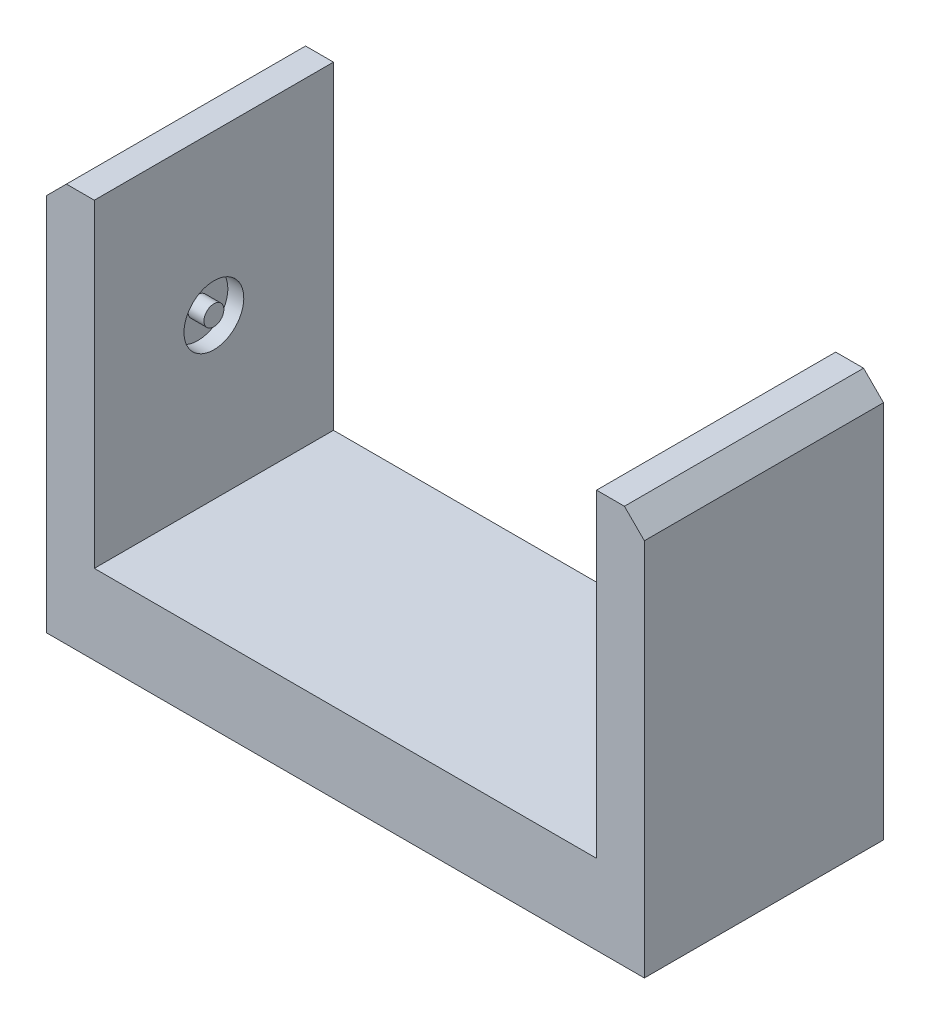
ISO-10303-21;
HEADER;
FILE_DESCRIPTION(('STEP AP214'),'2;1');
FILE_NAME('part.step','',(''),(''),'','','');
FILE_SCHEMA(('AUTOMOTIVE_DESIGN { 1 0 10303 214 1 1 1 1 }'));
ENDSEC;
DATA;
#1=APPLICATION_CONTEXT('core data for automotive mechanical design processes');
#2=APPLICATION_PROTOCOL_DEFINITION('international standard','automotive_design',2000,#1);
#3=PRODUCT_CONTEXT('',#1,'mechanical');
#4=PRODUCT('Part','Part','',(#3));
#5=PRODUCT_RELATED_PRODUCT_CATEGORY('part','',(#4));
#6=PRODUCT_DEFINITION_FORMATION('','',#4);
#7=PRODUCT_DEFINITION_CONTEXT('part definition',#1,'design');
#8=PRODUCT_DEFINITION('design','',#6,#7);
#9=PRODUCT_DEFINITION_SHAPE('','',#8);
#10=(LENGTH_UNIT() NAMED_UNIT(*) SI_UNIT(.MILLI.,.METRE.));
#11=(NAMED_UNIT(*) PLANE_ANGLE_UNIT() SI_UNIT($,.RADIAN.));
#12=(NAMED_UNIT(*) SI_UNIT($,.STERADIAN.) SOLID_ANGLE_UNIT());
#13=UNCERTAINTY_MEASURE_WITH_UNIT(LENGTH_MEASURE(1.E-05),#10,'distance_accuracy_value','');
#14=(GEOMETRIC_REPRESENTATION_CONTEXT(3) GLOBAL_UNCERTAINTY_ASSIGNED_CONTEXT((#13)) GLOBAL_UNIT_ASSIGNED_CONTEXT((#10,
#11,#12)) REPRESENTATION_CONTEXT('',''));
#15=CARTESIAN_POINT('',(0.,0.,0.));
#16=DIRECTION('',(0.,0.,1.));
#17=DIRECTION('',(1.,0.,0.));
#18=AXIS2_PLACEMENT_3D('',#15,#16,#17);
#19=CARTESIAN_POINT('',(0.,0.,30.));
#20=DIRECTION('',(0.,1.,0.));
#21=DIRECTION('',(-1.,0.,0.));
#22=AXIS2_PLACEMENT_3D('',#19,#20,#21);
#23=PLANE('',#22);
#24=CARTESIAN_POINT('',(0.,0.,0.));
#25=DIRECTION('',(0.,1.,0.));
#26=DIRECTION('',(-1.,0.,0.));
#27=AXIS2_PLACEMENT_3D('',#24,#25,#26);
#28=CIRCLE('',#27,20.);
#29=CARTESIAN_POINT('',(-20.,0.,0.));
#30=VERTEX_POINT('',#29);
#31=EDGE_CURVE('E11',#30,#30,#28,.F.);
#32=ORIENTED_EDGE('',*,*,#31,.F.);
#33=EDGE_LOOP('',(#32));
#34=FACE_BOUND('',#33,.T.);
#35=DIRECTION('',(1.,0.,0.));
#36=VECTOR('',#35,1.);
#37=CARTESIAN_POINT('',(0.,0.,-30.));
#38=LINE('',#37,#36);
#39=CARTESIAN_POINT('',(-75.,0.,-30.));
#40=VERTEX_POINT('',#39);
#41=CARTESIAN_POINT('',(75.,0.,-30.));
#42=VERTEX_POINT('',#41);
#43=EDGE_CURVE('E147',#40,#42,#38,.T.);
#44=ORIENTED_EDGE('',*,*,#43,.T.);
#45=DIRECTION('',(0.,0.,-1.));
#46=VECTOR('',#45,1.);
#47=CARTESIAN_POINT('',(75.,0.,30.));
#48=LINE('',#47,#46);
#49=CARTESIAN_POINT('',(75.,0.,30.));
#50=VERTEX_POINT('',#49);
#51=EDGE_CURVE('E45',#50,#42,#48,.T.);
#52=ORIENTED_EDGE('',*,*,#51,.F.);
#53=DIRECTION('',(1.,0.,0.));
#54=VECTOR('',#53,1.);
#55=CARTESIAN_POINT('',(0.,0.,30.));
#56=LINE('',#55,#54);
#57=CARTESIAN_POINT('',(-75.,0.,30.));
#58=VERTEX_POINT('',#57);
#59=EDGE_CURVE('E171',#58,#50,#56,.T.);
#60=ORIENTED_EDGE('',*,*,#59,.F.);
#61=DIRECTION('',(0.,0.,-1.));
#62=VECTOR('',#61,1.);
#63=CARTESIAN_POINT('',(-75.,0.,30.));
#64=LINE('',#63,#62);
#65=EDGE_CURVE('E53',#58,#40,#64,.T.);
#66=ORIENTED_EDGE('',*,*,#65,.T.);
#67=EDGE_LOOP('',(#44,#52,#60,#66));
#68=FACE_BOUND('',#67,.T.);
#69=ADVANCED_FACE('F37',(#34,#68),#23,.F.);
#70=CARTESIAN_POINT('',(75.,0.,30.));
#71=DIRECTION('',(-1.,0.,0.));
#72=DIRECTION('',(0.,-1.,0.));
#73=AXIS2_PLACEMENT_3D('',#70,#71,#72);
#74=PLANE('',#73);
#75=DIRECTION('',(0.,1.,0.));
#76=VECTOR('',#75,1.);
#77=CARTESIAN_POINT('',(75.,0.,-30.));
#78=LINE('',#77,#76);
#79=CARTESIAN_POINT('',(74.9999999999999,95.,-30.));
#80=VERTEX_POINT('',#79);
#81=EDGE_CURVE('E149',#42,#80,#78,.T.);
#82=ORIENTED_EDGE('',*,*,#81,.T.);
#83=DIRECTION('',(0.,0.,-1.));
#84=VECTOR('',#83,1.);
#85=CARTESIAN_POINT('',(74.9999999999999,95.,30.));
#86=LINE('',#85,#84);
#87=CARTESIAN_POINT('',(74.9999999999999,95.,30.));
#88=VERTEX_POINT('',#87);
#89=EDGE_CURVE('E185',#88,#80,#86,.T.);
#90=ORIENTED_EDGE('',*,*,#89,.F.);
#91=DIRECTION('',(0.,1.,0.));
#92=VECTOR('',#91,1.);
#93=CARTESIAN_POINT('',(75.,0.,30.));
#94=LINE('',#93,#92);
#95=EDGE_CURVE('E98',#50,#88,#94,.T.);
#96=ORIENTED_EDGE('',*,*,#95,.F.);
#97=ORIENTED_EDGE('',*,*,#51,.T.);
#98=EDGE_LOOP('',(#82,#90,#96,#97));
#99=FACE_BOUND('',#98,.T.);
#100=ADVANCED_FACE('F188',(#99),#74,.F.);
#101=CARTESIAN_POINT('',(85.,85.,30.));
#102=DIRECTION('',(-0.707106781186547,-0.707106781186547,0.));
#103=DIRECTION('',(0.707106781186548,-0.707106781186548,0.));
#104=AXIS2_PLACEMENT_3D('',#101,#102,#103);
#105=PLANE('',#104);
#106=DIRECTION('',(-0.707106781186548,0.707106781186548,0.));
#107=VECTOR('',#106,1.);
#108=CARTESIAN_POINT('',(85.,85.,-30.));
#109=LINE('',#108,#107);
#110=CARTESIAN_POINT('',(70.,100.,-30.));
#111=VERTEX_POINT('',#110);
#112=EDGE_CURVE('E152',#80,#111,#109,.T.);
#113=ORIENTED_EDGE('',*,*,#112,.T.);
#114=DIRECTION('',(0.,0.,-1.));
#115=VECTOR('',#114,1.);
#116=CARTESIAN_POINT('',(70.,100.,30.));
#117=LINE('',#116,#115);
#118=CARTESIAN_POINT('',(70.,100.,30.));
#119=VERTEX_POINT('',#118);
#120=EDGE_CURVE('E182',#119,#111,#117,.T.);
#121=ORIENTED_EDGE('',*,*,#120,.F.);
#122=DIRECTION('',(-0.707106781186548,0.707106781186548,0.));
#123=VECTOR('',#122,1.);
#124=CARTESIAN_POINT('',(85.,85.,30.));
#125=LINE('',#124,#123);
#126=EDGE_CURVE('E243',#88,#119,#125,.T.);
#127=ORIENTED_EDGE('',*,*,#126,.F.);
#128=ORIENTED_EDGE('',*,*,#89,.T.);
#129=EDGE_LOOP('',(#113,#121,#127,#128));
#130=FACE_BOUND('',#129,.T.);
#131=ADVANCED_FACE('F208',(#130),#105,.F.);
#132=CARTESIAN_POINT('',(0.,100.,30.));
#133=DIRECTION('',(0.,-1.,0.));
#134=DIRECTION('',(0.,0.,-1.));
#135=AXIS2_PLACEMENT_3D('',#132,#133,#134);
#136=PLANE('',#135);
#137=DIRECTION('',(-1.,0.,0.));
#138=VECTOR('',#137,1.);
#139=CARTESIAN_POINT('',(0.,100.,-30.));
#140=LINE('',#139,#138);
#141=CARTESIAN_POINT('',(63.,100.,-30.));
#142=VERTEX_POINT('',#141);
#143=EDGE_CURVE('E154',#111,#142,#140,.T.);
#144=ORIENTED_EDGE('',*,*,#143,.T.);
#145=DIRECTION('',(0.,0.,-1.));
#146=VECTOR('',#145,1.);
#147=CARTESIAN_POINT('',(63.,100.,30.));
#148=LINE('',#147,#146);
#149=CARTESIAN_POINT('',(63.,100.,30.));
#150=VERTEX_POINT('',#149);
#151=EDGE_CURVE('E179',#150,#142,#148,.T.);
#152=ORIENTED_EDGE('',*,*,#151,.F.);
#153=DIRECTION('',(-1.,0.,0.));
#154=VECTOR('',#153,1.);
#155=CARTESIAN_POINT('',(0.,100.,30.));
#156=LINE('',#155,#154);
#157=EDGE_CURVE('E245',#119,#150,#156,.T.);
#158=ORIENTED_EDGE('',*,*,#157,.F.);
#159=ORIENTED_EDGE('',*,*,#120,.T.);
#160=EDGE_LOOP('',(#144,#152,#158,#159));
#161=FACE_BOUND('',#160,.T.);
#162=ADVANCED_FACE('F266',(#161),#136,.F.);
#163=CARTESIAN_POINT('',(63.,0.,30.));
#164=DIRECTION('',(1.,0.,0.));
#165=DIRECTION('',(0.,1.,0.));
#166=AXIS2_PLACEMENT_3D('',#163,#164,#165);
#167=PLANE('',#166);
#168=CARTESIAN_POINT('',(63.,60.,0.));
#169=DIRECTION('',(1.,0.,0.));
#170=DIRECTION('',(0.,1.,0.));
#171=AXIS2_PLACEMENT_3D('',#168,#169,#170);
#172=CIRCLE('',#171,7.5);
#173=CARTESIAN_POINT('',(63.,67.5,0.));
#174=VERTEX_POINT('',#173);
#175=EDGE_CURVE('E432',#174,#174,#172,.T.);
#176=ORIENTED_EDGE('',*,*,#175,.T.);
#177=EDGE_LOOP('',(#176));
#178=FACE_BOUND('',#177,.T.);
#179=DIRECTION('',(0.,-1.,0.));
#180=VECTOR('',#179,1.);
#181=CARTESIAN_POINT('',(63.,0.,-30.));
#182=LINE('',#181,#180);
#183=CARTESIAN_POINT('',(63.,20.,-30.));
#184=VERTEX_POINT('',#183);
#185=EDGE_CURVE('E156',#142,#184,#182,.T.);
#186=ORIENTED_EDGE('',*,*,#185,.T.);
#187=DIRECTION('',(0.,0.,-1.));
#188=VECTOR('',#187,1.);
#189=CARTESIAN_POINT('',(63.,20.,30.));
#190=LINE('',#189,#188);
#191=CARTESIAN_POINT('',(63.,20.,30.));
#192=VERTEX_POINT('',#191);
#193=EDGE_CURVE('E177',#192,#184,#190,.T.);
#194=ORIENTED_EDGE('',*,*,#193,.F.);
#195=DIRECTION('',(0.,-1.,0.));
#196=VECTOR('',#195,1.);
#197=CARTESIAN_POINT('',(63.,0.,30.));
#198=LINE('',#197,#196);
#199=EDGE_CURVE('E247',#150,#192,#198,.T.);
#200=ORIENTED_EDGE('',*,*,#199,.F.);
#201=ORIENTED_EDGE('',*,*,#151,.T.);
#202=EDGE_LOOP('',(#186,#194,#200,#201));
#203=FACE_BOUND('',#202,.T.);
#204=ADVANCED_FACE('F262',(#178,#203),#167,.F.);
#205=CARTESIAN_POINT('',(0.,20.,30.));
#206=DIRECTION('',(0.,1.,0.));
#207=DIRECTION('',(-1.,0.,0.));
#208=AXIS2_PLACEMENT_3D('',#205,#206,#207);
#209=PLANE('',#208);
#210=DIRECTION('',(1.,0.,0.));
#211=VECTOR('',#210,1.);
#212=CARTESIAN_POINT('',(0.,20.,-30.));
#213=LINE('',#212,#211);
#214=CARTESIAN_POINT('',(-63.,20.,-30.));
#215=VERTEX_POINT('',#214);
#216=EDGE_CURVE('E159',#215,#184,#213,.T.);
#217=ORIENTED_EDGE('',*,*,#216,.F.);
#218=DIRECTION('',(0.,0.,-1.));
#219=VECTOR('',#218,1.);
#220=CARTESIAN_POINT('',(-63.,20.,30.));
#221=LINE('',#220,#219);
#222=CARTESIAN_POINT('',(-63.,20.,30.));
#223=VERTEX_POINT('',#222);
#224=EDGE_CURVE('E175',#223,#215,#221,.T.);
#225=ORIENTED_EDGE('',*,*,#224,.F.);
#226=DIRECTION('',(1.,0.,0.));
#227=VECTOR('',#226,1.);
#228=CARTESIAN_POINT('',(0.,20.,30.));
#229=LINE('',#228,#227);
#230=EDGE_CURVE('E249',#223,#192,#229,.T.);
#231=ORIENTED_EDGE('',*,*,#230,.T.);
#232=ORIENTED_EDGE('',*,*,#193,.T.);
#233=EDGE_LOOP('',(#217,#225,#231,#232));
#234=FACE_BOUND('',#233,.T.);
#235=ADVANCED_FACE('F258',(#234),#209,.T.);
#236=CARTESIAN_POINT('',(-63.,0.,30.));
#237=DIRECTION('',(1.,0.,0.));
#238=DIRECTION('',(0.,1.,0.));
#239=AXIS2_PLACEMENT_3D('',#236,#237,#238);
#240=PLANE('',#239);
#241=CARTESIAN_POINT('',(-63.,60.,0.));
#242=DIRECTION('',(1.,0.,0.));
#243=DIRECTION('',(0.,1.,0.));
#244=AXIS2_PLACEMENT_3D('',#241,#242,#243);
#245=CIRCLE('',#244,7.5);
#246=CARTESIAN_POINT('',(-63.,67.5,0.));
#247=VERTEX_POINT('',#246);
#248=EDGE_CURVE('E442',#247,#247,#245,.T.);
#249=ORIENTED_EDGE('',*,*,#248,.F.);
#250=EDGE_LOOP('',(#249));
#251=FACE_BOUND('',#250,.T.);
#252=DIRECTION('',(0.,-1.,0.));
#253=VECTOR('',#252,1.);
#254=CARTESIAN_POINT('',(-63.,0.,-30.));
#255=LINE('',#254,#253);
#256=CARTESIAN_POINT('',(-63.,100.,-30.));
#257=VERTEX_POINT('',#256);
#258=EDGE_CURVE('E162',#257,#215,#255,.T.);
#259=ORIENTED_EDGE('',*,*,#258,.F.);
#260=DIRECTION('',(0.,0.,-1.));
#261=VECTOR('',#260,1.);
#262=CARTESIAN_POINT('',(-63.,100.,30.));
#263=LINE('',#262,#261);
#264=CARTESIAN_POINT('',(-63.,100.,30.));
#265=VERTEX_POINT('',#264);
#266=EDGE_CURVE('E129',#265,#257,#263,.T.);
#267=ORIENTED_EDGE('',*,*,#266,.F.);
#268=DIRECTION('',(0.,-1.,0.));
#269=VECTOR('',#268,1.);
#270=CARTESIAN_POINT('',(-63.,0.,30.));
#271=LINE('',#270,#269);
#272=EDGE_CURVE('E139',#265,#223,#271,.T.);
#273=ORIENTED_EDGE('',*,*,#272,.T.);
#274=ORIENTED_EDGE('',*,*,#224,.T.);
#275=EDGE_LOOP('',(#259,#267,#273,#274));
#276=FACE_BOUND('',#275,.T.);
#277=ADVANCED_FACE('F253',(#251,#276),#240,.T.);
#278=CARTESIAN_POINT('',(0.,100.,30.));
#279=DIRECTION('',(0.,1.,0.));
#280=DIRECTION('',(0.,0.,1.));
#281=AXIS2_PLACEMENT_3D('',#278,#279,#280);
#282=PLANE('',#281);
#283=DIRECTION('',(1.,0.,0.));
#284=VECTOR('',#283,1.);
#285=CARTESIAN_POINT('',(0.,100.,-30.));
#286=LINE('',#285,#284);
#287=CARTESIAN_POINT('',(-70.,100.,-30.));
#288=VERTEX_POINT('',#287);
#289=EDGE_CURVE('E125',#288,#257,#286,.T.);
#290=ORIENTED_EDGE('',*,*,#289,.F.);
#291=DIRECTION('',(0.,0.,-1.));
#292=VECTOR('',#291,1.);
#293=CARTESIAN_POINT('',(-70.,100.,30.));
#294=LINE('',#293,#292);
#295=CARTESIAN_POINT('',(-70.,100.,30.));
#296=VERTEX_POINT('',#295);
#297=EDGE_CURVE('E120',#296,#288,#294,.T.);
#298=ORIENTED_EDGE('',*,*,#297,.F.);
#299=DIRECTION('',(1.,0.,0.));
#300=VECTOR('',#299,1.);
#301=CARTESIAN_POINT('',(0.,100.,30.));
#302=LINE('',#301,#300);
#303=EDGE_CURVE('E123',#296,#265,#302,.T.);
#304=ORIENTED_EDGE('',*,*,#303,.T.);
#305=ORIENTED_EDGE('',*,*,#266,.T.);
#306=EDGE_LOOP('',(#290,#298,#304,#305));
#307=FACE_BOUND('',#306,.T.);
#308=ADVANCED_FACE('F122',(#307),#282,.T.);
#309=CARTESIAN_POINT('',(-85.,85.,30.));
#310=DIRECTION('',(-0.707106781186547,0.707106781186547,0.));
#311=DIRECTION('',(-0.707106781186548,-0.707106781186548,0.));
#312=AXIS2_PLACEMENT_3D('',#309,#310,#311);
#313=PLANE('',#312);
#314=DIRECTION('',(0.707106781186548,0.707106781186548,0.));
#315=VECTOR('',#314,1.);
#316=CARTESIAN_POINT('',(-85.,85.,-30.));
#317=LINE('',#316,#315);
#318=CARTESIAN_POINT('',(-75.,95.,-30.));
#319=VERTEX_POINT('',#318);
#320=EDGE_CURVE('E166',#319,#288,#317,.T.);
#321=ORIENTED_EDGE('',*,*,#320,.F.);
#322=DIRECTION('',(0.,0.,-1.));
#323=VECTOR('',#322,1.);
#324=CARTESIAN_POINT('',(-75.,95.,30.));
#325=LINE('',#324,#323);
#326=CARTESIAN_POINT('',(-75.,95.,30.));
#327=VERTEX_POINT('',#326);
#328=EDGE_CURVE('E85',#327,#319,#325,.T.);
#329=ORIENTED_EDGE('',*,*,#328,.F.);
#330=DIRECTION('',(0.707106781186548,0.707106781186548,0.));
#331=VECTOR('',#330,1.);
#332=CARTESIAN_POINT('',(-85.,85.,30.));
#333=LINE('',#332,#331);
#334=EDGE_CURVE('E136',#327,#296,#333,.T.);
#335=ORIENTED_EDGE('',*,*,#334,.T.);
#336=ORIENTED_EDGE('',*,*,#297,.T.);
#337=EDGE_LOOP('',(#321,#329,#335,#336));
#338=FACE_BOUND('',#337,.T.);
#339=ADVANCED_FACE('F141',(#338),#313,.T.);
#340=CARTESIAN_POINT('',(-75.,0.,30.));
#341=DIRECTION('',(-1.,0.,0.));
#342=DIRECTION('',(0.,0.,1.));
#343=AXIS2_PLACEMENT_3D('',#340,#341,#342);
#344=PLANE('',#343);
#345=DIRECTION('',(0.,1.,0.));
#346=VECTOR('',#345,1.);
#347=CARTESIAN_POINT('',(-75.,0.,-30.));
#348=LINE('',#347,#346);
#349=EDGE_CURVE('E168',#40,#319,#348,.T.);
#350=ORIENTED_EDGE('',*,*,#349,.F.);
#351=ORIENTED_EDGE('',*,*,#65,.F.);
#352=DIRECTION('',(0.,1.,0.));
#353=VECTOR('',#352,1.);
#354=CARTESIAN_POINT('',(-75.,0.,30.));
#355=LINE('',#354,#353);
#356=EDGE_CURVE('E142',#58,#327,#355,.T.);
#357=ORIENTED_EDGE('',*,*,#356,.T.);
#358=ORIENTED_EDGE('',*,*,#328,.T.);
#359=EDGE_LOOP('',(#350,#351,#357,#358));
#360=FACE_BOUND('',#359,.T.);
#361=ADVANCED_FACE('F192',(#360),#344,.T.);
#362=CARTESIAN_POINT('',(0.,0.,30.));
#363=DIRECTION('',(0.,0.,1.));
#364=DIRECTION('',(1.,0.,0.));
#365=AXIS2_PLACEMENT_3D('',#362,#363,#364);
#366=PLANE('',#365);
#367=ORIENTED_EDGE('',*,*,#59,.T.);
#368=ORIENTED_EDGE('',*,*,#95,.T.);
#369=ORIENTED_EDGE('',*,*,#126,.T.);
#370=ORIENTED_EDGE('',*,*,#157,.T.);
#371=ORIENTED_EDGE('',*,*,#199,.T.);
#372=ORIENTED_EDGE('',*,*,#230,.F.);
#373=ORIENTED_EDGE('',*,*,#272,.F.);
#374=ORIENTED_EDGE('',*,*,#303,.F.);
#375=ORIENTED_EDGE('',*,*,#334,.F.);
#376=ORIENTED_EDGE('',*,*,#356,.F.);
#377=EDGE_LOOP('',(#367,#368,#369,#370,#371,#372,#373,#374,#375,#376));
#378=FACE_BOUND('',#377,.T.);
#379=ADVANCED_FACE('F134',(#378),#366,.T.);
#380=CARTESIAN_POINT('',(0.,0.,-30.));
#381=DIRECTION('',(0.,0.,1.));
#382=DIRECTION('',(1.,0.,0.));
#383=AXIS2_PLACEMENT_3D('',#380,#381,#382);
#384=PLANE('',#383);
#385=ORIENTED_EDGE('',*,*,#43,.F.);
#386=ORIENTED_EDGE('',*,*,#349,.T.);
#387=ORIENTED_EDGE('',*,*,#320,.T.);
#388=ORIENTED_EDGE('',*,*,#289,.T.);
#389=ORIENTED_EDGE('',*,*,#258,.T.);
#390=ORIENTED_EDGE('',*,*,#216,.T.);
#391=ORIENTED_EDGE('',*,*,#185,.F.);
#392=ORIENTED_EDGE('',*,*,#143,.F.);
#393=ORIENTED_EDGE('',*,*,#112,.F.);
#394=ORIENTED_EDGE('',*,*,#81,.F.);
#395=EDGE_LOOP('',(#385,#386,#387,#388,#389,#390,#391,#392,#393,#394));
#396=FACE_BOUND('',#395,.T.);
#397=ADVANCED_FACE('F190',(#396),#384,.F.);
#398=CARTESIAN_POINT('',(0.,-10.,0.));
#399=DIRECTION('',(0.,-1.,0.));
#400=DIRECTION('',(1.,0.,0.));
#401=AXIS2_PLACEMENT_3D('',#398,#399,#400);
#402=PLANE('',#401);
#403=CARTESIAN_POINT('',(0.,-10.,0.));
#404=DIRECTION('',(0.,-1.,0.));
#405=DIRECTION('',(1.,0.,0.));
#406=AXIS2_PLACEMENT_3D('',#403,#404,#405);
#407=CIRCLE('',#406,20.);
#408=CARTESIAN_POINT('',(20.,-9.99999999999999,0.));
#409=VERTEX_POINT('',#408);
#410=EDGE_CURVE('E150',#409,#409,#407,.T.);
#411=ORIENTED_EDGE('',*,*,#410,.T.);
#412=EDGE_LOOP('',(#411));
#413=FACE_BOUND('',#412,.T.);
#414=CARTESIAN_POINT('',(0.,-10.,0.));
#415=DIRECTION('',(0.,-1.,0.));
#416=DIRECTION('',(1.,0.,0.));
#417=AXIS2_PLACEMENT_3D('',#414,#415,#416);
#418=CIRCLE('',#417,18.);
#419=CARTESIAN_POINT('',(18.,-9.99999999999999,0.));
#420=VERTEX_POINT('',#419);
#421=EDGE_CURVE('E229',#420,#420,#418,.T.);
#422=ORIENTED_EDGE('',*,*,#421,.F.);
#423=EDGE_LOOP('',(#422));
#424=FACE_BOUND('',#423,.T.);
#425=ADVANCED_FACE('F318',(#413,#424),#402,.T.);
#426=CARTESIAN_POINT('',(0.,-10.,0.));
#427=DIRECTION('',(0.,1.,0.));
#428=DIRECTION('',(-1.,0.,0.));
#429=AXIS2_PLACEMENT_3D('',#426,#427,#428);
#430=CYLINDRICAL_SURFACE('',#429,20.);
#431=ORIENTED_EDGE('',*,*,#410,.F.);
#432=EDGE_LOOP('',(#431));
#433=FACE_BOUND('',#432,.T.);
#434=ORIENTED_EDGE('',*,*,#31,.T.);
#435=EDGE_LOOP('',(#434));
#436=FACE_BOUND('',#435,.T.);
#437=ADVANCED_FACE('F222',(#433,#436),#430,.T.);
#438=CARTESIAN_POINT('',(0.,-10.,0.));
#439=DIRECTION('',(0.,1.,0.));
#440=DIRECTION('',(-1.,0.,0.));
#441=AXIS2_PLACEMENT_3D('',#438,#439,#440);
#442=CYLINDRICAL_SURFACE('',#441,18.);
#443=ORIENTED_EDGE('',*,*,#421,.T.);
#444=EDGE_LOOP('',(#443));
#445=FACE_BOUND('',#444,.T.);
#446=CARTESIAN_POINT('',(0.,0.,0.));
#447=DIRECTION('',(0.,-1.,0.));
#448=DIRECTION('',(1.,0.,0.));
#449=AXIS2_PLACEMENT_3D('',#446,#447,#448);
#450=CIRCLE('',#449,18.);
#451=CARTESIAN_POINT('',(18.,0.,0.));
#452=VERTEX_POINT('',#451);
#453=EDGE_CURVE('E227',#452,#452,#450,.T.);
#454=ORIENTED_EDGE('',*,*,#453,.F.);
#455=EDGE_LOOP('',(#454));
#456=FACE_BOUND('',#455,.T.);
#457=ADVANCED_FACE('F212',(#445,#456),#442,.F.);
#458=ORIENTED_EDGE('',*,*,#453,.T.);
#459=EDGE_LOOP('',(#458));
#460=FACE_BOUND('',#459,.T.);
#461=ADVANCED_FACE('F204',(#460),#23,.F.);
#462=CARTESIAN_POINT('',(-67.,60.,0.));
#463=DIRECTION('',(1.,0.,0.));
#464=DIRECTION('',(0.,1.,0.));
#465=AXIS2_PLACEMENT_3D('',#462,#463,#464);
#466=CYLINDRICAL_SURFACE('',#465,2.5);
#467=CARTESIAN_POINT('',(-67.,60.,0.));
#468=DIRECTION('',(1.,0.,0.));
#469=DIRECTION('',(0.,1.,0.));
#470=AXIS2_PLACEMENT_3D('',#467,#468,#469);
#471=CIRCLE('',#470,2.5);
#472=CARTESIAN_POINT('',(-67.,62.5,0.));
#473=VERTEX_POINT('',#472);
#474=EDGE_CURVE('E235',#473,#473,#471,.T.);
#475=ORIENTED_EDGE('',*,*,#474,.T.);
#476=EDGE_LOOP('',(#475));
#477=FACE_BOUND('',#476,.T.);
#478=CARTESIAN_POINT('',(-63.,60.,0.));
#479=DIRECTION('',(1.,0.,0.));
#480=DIRECTION('',(0.,1.,0.));
#481=AXIS2_PLACEMENT_3D('',#478,#479,#480);
#482=CIRCLE('',#481,2.5);
#483=CARTESIAN_POINT('',(-63.,62.5,0.));
#484=VERTEX_POINT('',#483);
#485=EDGE_CURVE('E444',#484,#484,#482,.T.);
#486=ORIENTED_EDGE('',*,*,#485,.F.);
#487=EDGE_LOOP('',(#486));
#488=FACE_BOUND('',#487,.T.);
#489=ADVANCED_FACE('F211',(#477,#488),#466,.T.);
#490=CARTESIAN_POINT('',(-67.,60.,0.));
#491=DIRECTION('',(1.,0.,0.));
#492=DIRECTION('',(0.,1.,0.));
#493=AXIS2_PLACEMENT_3D('',#490,#491,#492);
#494=CYLINDRICAL_SURFACE('',#493,7.5);
#495=CARTESIAN_POINT('',(-67.,60.,0.));
#496=DIRECTION('',(1.,0.,0.));
#497=DIRECTION('',(0.,1.,0.));
#498=AXIS2_PLACEMENT_3D('',#495,#496,#497);
#499=CIRCLE('',#498,7.5);
#500=CARTESIAN_POINT('',(-67.,67.5,0.));
#501=VERTEX_POINT('',#500);
#502=EDGE_CURVE('E230',#501,#501,#499,.T.);
#503=ORIENTED_EDGE('',*,*,#502,.F.);
#504=EDGE_LOOP('',(#503));
#505=FACE_BOUND('',#504,.T.);
#506=ORIENTED_EDGE('',*,*,#248,.T.);
#507=EDGE_LOOP('',(#506));
#508=FACE_BOUND('',#507,.T.);
#509=ADVANCED_FACE('F219',(#505,#508),#494,.F.);
#510=CARTESIAN_POINT('',(-67.,0.,0.));
#511=DIRECTION('',(1.,0.,0.));
#512=DIRECTION('',(0.,1.,0.));
#513=AXIS2_PLACEMENT_3D('',#510,#511,#512);
#514=PLANE('',#513);
#515=ORIENTED_EDGE('',*,*,#474,.F.);
#516=EDGE_LOOP('',(#515));
#517=FACE_BOUND('',#516,.T.);
#518=ORIENTED_EDGE('',*,*,#502,.T.);
#519=EDGE_LOOP('',(#518));
#520=FACE_BOUND('',#519,.T.);
#521=ADVANCED_FACE('F368',(#517,#520),#514,.T.);
#522=ORIENTED_EDGE('',*,*,#485,.T.);
#523=EDGE_LOOP('',(#522));
#524=FACE_BOUND('',#523,.T.);
#525=ADVANCED_FACE('F286',(#524),#240,.T.);
#526=CARTESIAN_POINT('',(67.,60.,0.));
#527=DIRECTION('',(-1.,0.,0.));
#528=DIRECTION('',(0.,-1.,0.));
#529=AXIS2_PLACEMENT_3D('',#526,#527,#528);
#530=CYLINDRICAL_SURFACE('',#529,2.5);
#531=CARTESIAN_POINT('',(67.,60.,0.));
#532=DIRECTION('',(1.,0.,0.));
#533=DIRECTION('',(0.,1.,0.));
#534=AXIS2_PLACEMENT_3D('',#531,#532,#533);
#535=CIRCLE('',#534,2.5);
#536=CARTESIAN_POINT('',(67.,62.5,0.));
#537=VERTEX_POINT('',#536);
#538=EDGE_CURVE('E435',#537,#537,#535,.T.);
#539=ORIENTED_EDGE('',*,*,#538,.F.);
#540=EDGE_LOOP('',(#539));
#541=FACE_BOUND('',#540,.T.);
#542=CARTESIAN_POINT('',(63.,60.,0.));
#543=DIRECTION('',(1.,0.,0.));
#544=DIRECTION('',(0.,1.,0.));
#545=AXIS2_PLACEMENT_3D('',#542,#543,#544);
#546=CIRCLE('',#545,2.5);
#547=CARTESIAN_POINT('',(63.,62.5,0.));
#548=VERTEX_POINT('',#547);
#549=EDGE_CURVE('E430',#548,#548,#546,.T.);
#550=ORIENTED_EDGE('',*,*,#549,.T.);
#551=EDGE_LOOP('',(#550));
#552=FACE_BOUND('',#551,.T.);
#553=ADVANCED_FACE('F386',(#541,#552),#530,.T.);
#554=CARTESIAN_POINT('',(67.,60.,0.));
#555=DIRECTION('',(-1.,0.,0.));
#556=DIRECTION('',(0.,-1.,0.));
#557=AXIS2_PLACEMENT_3D('',#554,#555,#556);
#558=CYLINDRICAL_SURFACE('',#557,7.5);
#559=CARTESIAN_POINT('',(67.,60.,0.));
#560=DIRECTION('',(1.,0.,0.));
#561=DIRECTION('',(0.,1.,0.));
#562=AXIS2_PLACEMENT_3D('',#559,#560,#561);
#563=CIRCLE('',#562,7.5);
#564=CARTESIAN_POINT('',(67.,67.5,0.));
#565=VERTEX_POINT('',#564);
#566=EDGE_CURVE('E438',#565,#565,#563,.T.);
#567=ORIENTED_EDGE('',*,*,#566,.T.);
#568=EDGE_LOOP('',(#567));
#569=FACE_BOUND('',#568,.T.);
#570=ORIENTED_EDGE('',*,*,#175,.F.);
#571=EDGE_LOOP('',(#570));
#572=FACE_BOUND('',#571,.T.);
#573=ADVANCED_FACE('F398',(#569,#572),#558,.F.);
#574=CARTESIAN_POINT('',(67.,0.,0.));
#575=DIRECTION('',(-1.,0.,0.));
#576=DIRECTION('',(0.,1.,0.));
#577=AXIS2_PLACEMENT_3D('',#574,#575,#576);
#578=PLANE('',#577);
#579=ORIENTED_EDGE('',*,*,#538,.T.);
#580=EDGE_LOOP('',(#579));
#581=FACE_BOUND('',#580,.T.);
#582=ORIENTED_EDGE('',*,*,#566,.F.);
#583=EDGE_LOOP('',(#582));
#584=FACE_BOUND('',#583,.T.);
#585=ADVANCED_FACE('F408',(#581,#584),#578,.T.);
#586=ORIENTED_EDGE('',*,*,#549,.F.);
#587=EDGE_LOOP('',(#586));
#588=FACE_BOUND('',#587,.T.);
#589=ADVANCED_FACE('F280',(#588),#167,.F.);
#590=CLOSED_SHELL('',(#69,#100,#131,#162,#204,#235,#277,#308,#339,#361,#379,#397,#425,#437,#457,
#461,#489,#509,#521,#525,#553,#573,#585,#589));
#591=MANIFOLD_SOLID_BREP('B2',#590);
#592=ADVANCED_BREP_SHAPE_REPRESENTATION('',(#18,#591),#14);
#593=SHAPE_DEFINITION_REPRESENTATION(#9,#592);
ENDSEC;
END-ISO-10303-21;
